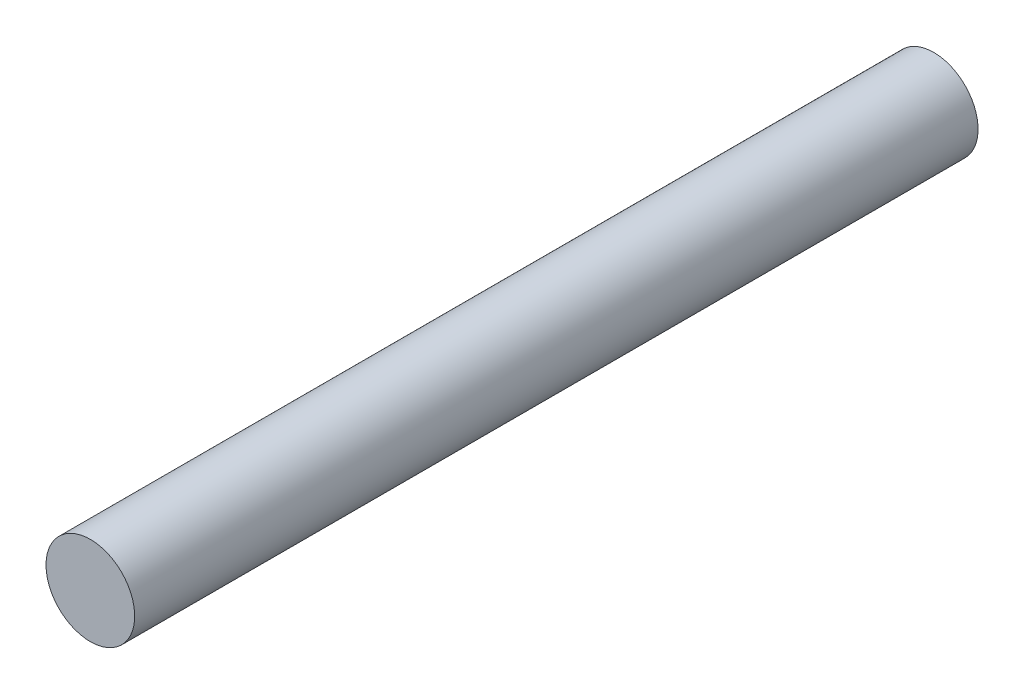
ISO-10303-21;
HEADER;
FILE_DESCRIPTION(('STEP AP214'),'2;1');
FILE_NAME('part.step','',(''),(''),'','','');
FILE_SCHEMA(('AUTOMOTIVE_DESIGN { 1 0 10303 214 1 1 1 1 }'));
ENDSEC;
DATA;
#1=APPLICATION_CONTEXT('core data for automotive mechanical design processes');
#2=APPLICATION_PROTOCOL_DEFINITION('international standard','automotive_design',2000,#1);
#3=PRODUCT_CONTEXT('',#1,'mechanical');
#4=PRODUCT('Part','Part','',(#3));
#5=PRODUCT_RELATED_PRODUCT_CATEGORY('part','',(#4));
#6=PRODUCT_DEFINITION_FORMATION('','',#4);
#7=PRODUCT_DEFINITION_CONTEXT('part definition',#1,'design');
#8=PRODUCT_DEFINITION('design','',#6,#7);
#9=PRODUCT_DEFINITION_SHAPE('','',#8);
#10=(LENGTH_UNIT() NAMED_UNIT(*) SI_UNIT(.MILLI.,.METRE.));
#11=(NAMED_UNIT(*) PLANE_ANGLE_UNIT() SI_UNIT($,.RADIAN.));
#12=(NAMED_UNIT(*) SI_UNIT($,.STERADIAN.) SOLID_ANGLE_UNIT());
#13=UNCERTAINTY_MEASURE_WITH_UNIT(LENGTH_MEASURE(1.E-05),#10,'distance_accuracy_value','');
#14=(GEOMETRIC_REPRESENTATION_CONTEXT(3) GLOBAL_UNCERTAINTY_ASSIGNED_CONTEXT((#13)) GLOBAL_UNIT_ASSIGNED_CONTEXT((#10,
#11,#12)) REPRESENTATION_CONTEXT('',''));
#15=CARTESIAN_POINT('',(0.,0.,0.));
#16=DIRECTION('',(0.,0.,1.));
#17=DIRECTION('',(1.,0.,0.));
#18=AXIS2_PLACEMENT_3D('',#15,#16,#17);
#19=CARTESIAN_POINT('',(0.,0.,95.1));
#20=DIRECTION('',(0.,0.,-1.));
#21=DIRECTION('',(-1.,0.,0.));
#22=AXIS2_PLACEMENT_3D('',#19,#20,#21);
#23=CYLINDRICAL_SURFACE('',#22,5.);
#24=CARTESIAN_POINT('',(0.,0.,95.1));
#25=DIRECTION('',(0.,0.,1.));
#26=DIRECTION('',(1.,0.,0.));
#27=AXIS2_PLACEMENT_3D('',#24,#25,#26);
#28=CIRCLE('',#27,5.);
#29=CARTESIAN_POINT('',(-5.,0.,95.1));
#30=VERTEX_POINT('',#29);
#31=EDGE_CURVE('E10',#30,#30,#28,.T.);
#32=CARTESIAN_POINT('',(0.,0.,0.));
#33=DIRECTION('',(0.,0.,1.));
#34=DIRECTION('',(1.,0.,0.));
#35=AXIS2_PLACEMENT_3D('',#32,#33,#34);
#36=CIRCLE('',#35,5.);
#37=CARTESIAN_POINT('',(-5.,0.,0.));
#38=VERTEX_POINT('',#37);
#39=EDGE_CURVE('E46',#38,#38,#36,.T.);
#40=CARTESIAN_POINT('',(-5.,0.,95.1));
#41=CARTESIAN_POINT('',(-5.,0.,94.109375));
#42=CARTESIAN_POINT('',(-5.,0.,93.11875));
#43=CARTESIAN_POINT('',(-5.,0.,91.1375));
#44=CARTESIAN_POINT('',(-5.,0.,90.146875));
#45=CARTESIAN_POINT('',(-5.,0.,88.165625));
#46=CARTESIAN_POINT('',(-5.,0.,87.175));
#47=CARTESIAN_POINT('',(-5.,0.,85.19375));
#48=CARTESIAN_POINT('',(-5.,0.,84.203125));
#49=CARTESIAN_POINT('',(-5.,0.,82.221875));
#50=CARTESIAN_POINT('',(-5.,0.,81.23125));
#51=CARTESIAN_POINT('',(-5.,0.,79.25));
#52=CARTESIAN_POINT('',(-5.,0.,78.259375));
#53=CARTESIAN_POINT('',(-5.,0.,76.278125));
#54=CARTESIAN_POINT('',(-5.,0.,75.2875));
#55=CARTESIAN_POINT('',(-5.,0.,73.30625));
#56=CARTESIAN_POINT('',(-5.,0.,72.315625));
#57=CARTESIAN_POINT('',(-5.,0.,70.334375));
#58=CARTESIAN_POINT('',(-5.,0.,69.34375));
#59=CARTESIAN_POINT('',(-5.,0.,67.3625));
#60=CARTESIAN_POINT('',(-5.,0.,66.371875));
#61=CARTESIAN_POINT('',(-5.,0.,64.390625));
#62=CARTESIAN_POINT('',(-5.,0.,63.4));
#63=CARTESIAN_POINT('',(-5.,0.,61.41875));
#64=CARTESIAN_POINT('',(-5.,0.,60.428125));
#65=CARTESIAN_POINT('',(-5.,0.,58.446875));
#66=CARTESIAN_POINT('',(-5.,0.,57.45625));
#67=CARTESIAN_POINT('',(-5.,0.,55.475));
#68=CARTESIAN_POINT('',(-5.,0.,54.484375));
#69=CARTESIAN_POINT('',(-5.,0.,52.503125));
#70=CARTESIAN_POINT('',(-5.,0.,51.5125));
#71=CARTESIAN_POINT('',(-5.,0.,49.53125));
#72=CARTESIAN_POINT('',(-5.,0.,48.540625));
#73=CARTESIAN_POINT('',(-5.,0.,46.559375));
#74=CARTESIAN_POINT('',(-5.,0.,45.56875));
#75=CARTESIAN_POINT('',(-5.,0.,43.5875));
#76=CARTESIAN_POINT('',(-5.,0.,42.596875));
#77=CARTESIAN_POINT('',(-5.,0.,40.615625));
#78=CARTESIAN_POINT('',(-5.,0.,39.625));
#79=CARTESIAN_POINT('',(-5.,0.,37.64375));
#80=CARTESIAN_POINT('',(-5.,0.,36.653125));
#81=CARTESIAN_POINT('',(-5.,0.,34.671875));
#82=CARTESIAN_POINT('',(-5.,0.,33.68125));
#83=CARTESIAN_POINT('',(-5.,0.,31.7));
#84=CARTESIAN_POINT('',(-5.,0.,30.709375));
#85=CARTESIAN_POINT('',(-5.,0.,28.728125));
#86=CARTESIAN_POINT('',(-5.,0.,27.7375));
#87=CARTESIAN_POINT('',(-5.,0.,25.75625));
#88=CARTESIAN_POINT('',(-5.,0.,24.765625));
#89=CARTESIAN_POINT('',(-5.,0.,22.784375));
#90=CARTESIAN_POINT('',(-5.,0.,21.79375));
#91=CARTESIAN_POINT('',(-5.,0.,19.8125));
#92=CARTESIAN_POINT('',(-5.,0.,18.821875));
#93=CARTESIAN_POINT('',(-5.,0.,16.840625));
#94=CARTESIAN_POINT('',(-5.,0.,15.85));
#95=CARTESIAN_POINT('',(-5.,0.,13.86875));
#96=CARTESIAN_POINT('',(-5.,0.,12.878125));
#97=CARTESIAN_POINT('',(-5.,0.,10.896875));
#98=CARTESIAN_POINT('',(-5.,0.,9.90624999999998));
#99=CARTESIAN_POINT('',(-5.,0.,7.92499999999998));
#100=CARTESIAN_POINT('',(-5.,0.,6.93437499999998));
#101=CARTESIAN_POINT('',(-5.,0.,4.95312499999998));
#102=CARTESIAN_POINT('',(-5.,0.,3.96249999999999));
#103=CARTESIAN_POINT('',(-5.,0.,1.98124999999999));
#104=CARTESIAN_POINT('',(-5.,0.,0.990624999999985));
#105=CARTESIAN_POINT('',(-5.,0.,0.));
#106=B_SPLINE_CURVE_WITH_KNOTS('',3,(#40,#41,#42,#43,#44,#45,#46,#47,#48,#49,#50,#51,#52,#53,
#54,#55,#56,#57,#58,#59,#60,#61,#62,#63,#64,#65,#66,#67,#68,#69,#70,#71,#72,#73,#74,#75,#76,#77,
#78,#79,#80,#81,#82,#83,#84,#85,#86,#87,#88,#89,#90,#91,#92,#93,#94,#95,#96,#97,#98,#99,#100,
#101,#102,#103,#104,#105),.UNSPECIFIED.,.F.,.F.,(4,2,2,2,2,2,2,2,2,2,2,2,2,2,2,2,2,2,2,2,2,2,2,
2,2,2,2,2,2,2,2,2,4),(0.,2.971875,5.94375,8.915625,11.8875,14.859375,17.83125,20.803125,23.775,
26.746875,29.71875,32.690625,35.6625,38.634375,41.60625,44.578125,47.55,50.521875,53.49375,
56.465625,59.4375,62.409375,65.38125,68.353125,71.325,74.296875,77.26875,80.240625,83.2125,
86.184375,89.15625,92.128125,95.1),.UNSPECIFIED.);
#107=EDGE_CURVE('BSEAM43',#30,#38,#106,.T.);
#108=ORIENTED_EDGE('',*,*,#31,.F.);
#109=ORIENTED_EDGE('',*,*,#39,.T.);
#110=ORIENTED_EDGE('',*,*,#107,.T.);
#111=ORIENTED_EDGE('',*,*,#107,.F.);
#112=EDGE_LOOP('',(#108,#110,#109,#111));
#113=FACE_BOUND('',#112,.T.);
#114=ADVANCED_FACE('F43',(#113),#23,.T.);
#115=CARTESIAN_POINT('',(0.,0.,95.1));
#116=DIRECTION('',(0.,0.,1.));
#117=DIRECTION('',(1.,0.,0.));
#118=AXIS2_PLACEMENT_3D('',#115,#116,#117);
#119=PLANE('',#118);
#120=ORIENTED_EDGE('',*,*,#31,.T.);
#121=EDGE_LOOP('',(#120));
#122=FACE_BOUND('',#121,.T.);
#123=ADVANCED_FACE('F60',(#122),#119,.T.);
#124=CARTESIAN_POINT('',(0.,0.,0.));
#125=DIRECTION('',(0.,0.,1.));
#126=DIRECTION('',(1.,0.,0.));
#127=AXIS2_PLACEMENT_3D('',#124,#125,#126);
#128=PLANE('',#127);
#129=ORIENTED_EDGE('',*,*,#39,.F.);
#130=EDGE_LOOP('',(#129));
#131=FACE_BOUND('',#130,.T.);
#132=ADVANCED_FACE('F58',(#131),#128,.F.);
#133=CLOSED_SHELL('',(#114,#123,#132));
#134=MANIFOLD_SOLID_BREP('B2',#133);
#135=ADVANCED_BREP_SHAPE_REPRESENTATION('',(#18,#134),#14);
#136=SHAPE_DEFINITION_REPRESENTATION(#9,#135);
ENDSEC;
END-ISO-10303-21;
